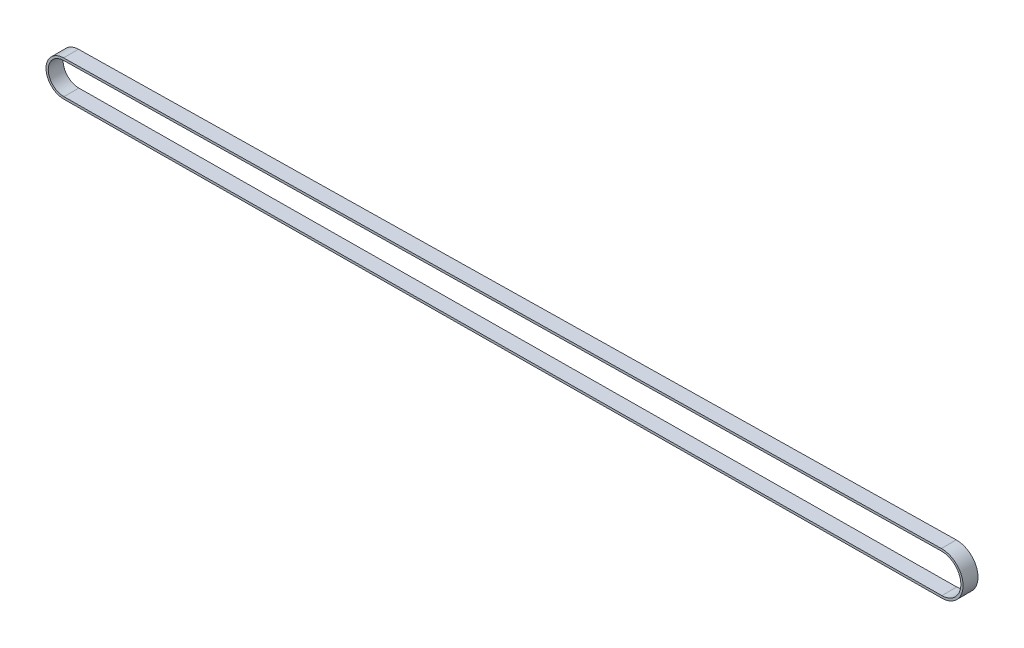
ISO-10303-21;
HEADER;
FILE_DESCRIPTION(('STEP AP214'),'2;1');
FILE_NAME('part.step','',(''),(''),'','','');
FILE_SCHEMA(('AUTOMOTIVE_DESIGN { 1 0 10303 214 1 1 1 1 }'));
ENDSEC;
DATA;
#1=APPLICATION_CONTEXT('core data for automotive mechanical design processes');
#2=APPLICATION_PROTOCOL_DEFINITION('international standard','automotive_design',2000,#1);
#3=PRODUCT_CONTEXT('',#1,'mechanical');
#4=PRODUCT('Part','Part','',(#3));
#5=PRODUCT_RELATED_PRODUCT_CATEGORY('part','',(#4));
#6=PRODUCT_DEFINITION_FORMATION('','',#4);
#7=PRODUCT_DEFINITION_CONTEXT('part definition',#1,'design');
#8=PRODUCT_DEFINITION('design','',#6,#7);
#9=PRODUCT_DEFINITION_SHAPE('','',#8);
#10=(LENGTH_UNIT() NAMED_UNIT(*) SI_UNIT(.MILLI.,.METRE.));
#11=(NAMED_UNIT(*) PLANE_ANGLE_UNIT() SI_UNIT($,.RADIAN.));
#12=(NAMED_UNIT(*) SI_UNIT($,.STERADIAN.) SOLID_ANGLE_UNIT());
#13=UNCERTAINTY_MEASURE_WITH_UNIT(LENGTH_MEASURE(1.E-05),#10,'distance_accuracy_value','');
#14=(GEOMETRIC_REPRESENTATION_CONTEXT(3) GLOBAL_UNCERTAINTY_ASSIGNED_CONTEXT((#13)) GLOBAL_UNIT_ASSIGNED_CONTEXT((#10,
#11,#12)) REPRESENTATION_CONTEXT('',''));
#15=CARTESIAN_POINT('',(0.,0.,0.));
#16=DIRECTION('',(0.,0.,1.));
#17=DIRECTION('',(1.,0.,0.));
#18=AXIS2_PLACEMENT_3D('',#15,#16,#17);
#19=CARTESIAN_POINT('',(0.497907466428943,-4.82437437963457,2.5));
#20=DIRECTION('',(0.,0.,-1.));
#21=DIRECTION('',(-1.,0.,0.));
#22=AXIS2_PLACEMENT_3D('',#19,#20,#21);
#23=CYLINDRICAL_SURFACE('',#22,5.975);
#24=CARTESIAN_POINT('',(0.497907466428943,-4.82437437963457,-2.5));
#25=DIRECTION('',(0.,0.,-1.));
#26=DIRECTION('',(-1.,0.,0.));
#27=AXIS2_PLACEMENT_3D('',#24,#25,#26);
#28=CIRCLE('',#27,5.975);
#29=CARTESIAN_POINT('',(0.544490680319643,-10.799192787267,-2.5));
#30=VERTEX_POINT('',#29);
#31=CARTESIAN_POINT('',(0.402597054026486,1.14986539838637,-2.5));
#32=VERTEX_POINT('',#31);
#33=EDGE_CURVE('E157',#30,#32,#28,.T.);
#34=ORIENTED_EDGE('',*,*,#33,.F.);
#35=DIRECTION('',(0.,0.,-1.));
#36=VECTOR('',#35,1.);
#37=CARTESIAN_POINT('',(0.544490680319643,-10.799192787267,2.5));
#38=LINE('',#37,#36);
#39=CARTESIAN_POINT('',(0.544490680319643,-10.799192787267,2.5));
#40=VERTEX_POINT('',#39);
#41=EDGE_CURVE('E12',#40,#30,#38,.T.);
#42=ORIENTED_EDGE('',*,*,#41,.F.);
#43=CARTESIAN_POINT('',(0.497907466428943,-4.82437437963457,2.5));
#44=DIRECTION('',(0.,0.,-1.));
#45=DIRECTION('',(-1.,0.,0.));
#46=AXIS2_PLACEMENT_3D('',#43,#44,#45);
#47=CIRCLE('',#46,5.975);
#48=CARTESIAN_POINT('',(0.402597054026486,1.14986539838637,2.5));
#49=VERTEX_POINT('',#48);
#50=EDGE_CURVE('E161',#40,#49,#47,.T.);
#51=ORIENTED_EDGE('',*,*,#50,.T.);
#52=DIRECTION('',(0.,0.,-1.));
#53=VECTOR('',#52,1.);
#54=CARTESIAN_POINT('',(0.402597054026486,1.14986539838637,2.5));
#55=LINE('',#54,#53);
#56=EDGE_CURVE('E62',#49,#32,#55,.T.);
#57=ORIENTED_EDGE('',*,*,#56,.T.);
#58=EDGE_LOOP('',(#34,#42,#51,#57));
#59=FACE_BOUND('',#58,.T.);
#60=ADVANCED_FACE('F59',(#59),#23,.T.);
#61=CARTESIAN_POINT('',(0.544490680319672,-10.799192787267,2.5));
#62=DIRECTION('',(0.00779635378924341,-0.999969607971959,0.));
#63=DIRECTION('',(0.999969607971959,0.00779635378924341,0.));
#64=AXIS2_PLACEMENT_3D('',#61,#62,#63);
#65=PLANE('',#64);
#66=DIRECTION('',(-0.999969607971959,-0.00779635378924341,0.));
#67=VECTOR('',#66,1.);
#68=CARTESIAN_POINT('',(0.544490680319672,-10.799192787267,-2.5));
#69=LINE('',#68,#67);
#70=CARTESIAN_POINT('',(294.803846304865,-8.50497301903174,-2.5));
#71=VERTEX_POINT('',#70);
#72=EDGE_CURVE('E165',#71,#30,#69,.T.);
#73=ORIENTED_EDGE('',*,*,#72,.F.);
#74=DIRECTION('',(0.,0.,-1.));
#75=VECTOR('',#74,1.);
#76=CARTESIAN_POINT('',(294.803846304865,-8.50497301903174,2.5));
#77=LINE('',#76,#75);
#78=CARTESIAN_POINT('',(294.803846304865,-8.50497301903174,2.5));
#79=VERTEX_POINT('',#78);
#80=EDGE_CURVE('E67',#79,#71,#77,.T.);
#81=ORIENTED_EDGE('',*,*,#80,.F.);
#82=DIRECTION('',(-0.999969607971959,-0.00779635378924341,0.));
#83=VECTOR('',#82,1.);
#84=CARTESIAN_POINT('',(0.544490680319672,-10.799192787267,2.5));
#85=LINE('',#84,#83);
#86=EDGE_CURVE('E171',#79,#40,#85,.T.);
#87=ORIENTED_EDGE('',*,*,#86,.T.);
#88=ORIENTED_EDGE('',*,*,#41,.T.);
#89=EDGE_LOOP('',(#73,#81,#87,#88));
#90=FACE_BOUND('',#89,.T.);
#91=ADVANCED_FACE('F197',(#90),#65,.T.);
#92=CARTESIAN_POINT('',(294.747907466428,-1.33019108183294,2.5));
#93=DIRECTION('',(0.,0.,-1.));
#94=DIRECTION('',(-1.,0.,0.));
#95=AXIS2_PLACEMENT_3D('',#92,#93,#94);
#96=CYLINDRICAL_SURFACE('',#95,7.175);
#97=CARTESIAN_POINT('',(294.747907466428,-1.33019108183294,-2.5));
#98=DIRECTION('',(0.,0.,-1.));
#99=DIRECTION('',(-1.,0.,0.));
#100=AXIS2_PLACEMENT_3D('',#97,#98,#99);
#101=CIRCLE('',#100,7.175);
#102=CARTESIAN_POINT('',(294.633455213877,5.84389601562317,-2.5));
#103=VERTEX_POINT('',#102);
#104=EDGE_CURVE('E179',#103,#71,#101,.T.);
#105=ORIENTED_EDGE('',*,*,#104,.F.);
#106=DIRECTION('',(0.,0.,-1.));
#107=VECTOR('',#106,1.);
#108=CARTESIAN_POINT('',(294.633455213877,5.84389601562317,2.5));
#109=LINE('',#108,#107);
#110=CARTESIAN_POINT('',(294.633455213877,5.84389601562317,2.5));
#111=VERTEX_POINT('',#110);
#112=EDGE_CURVE('E184',#111,#103,#109,.T.);
#113=ORIENTED_EDGE('',*,*,#112,.F.);
#114=CARTESIAN_POINT('',(294.747907466428,-1.33019108183294,2.5));
#115=DIRECTION('',(0.,0.,-1.));
#116=DIRECTION('',(-1.,0.,0.));
#117=AXIS2_PLACEMENT_3D('',#114,#115,#116);
#118=CIRCLE('',#117,7.175);
#119=EDGE_CURVE('E168',#111,#79,#118,.T.);
#120=ORIENTED_EDGE('',*,*,#119,.T.);
#121=ORIENTED_EDGE('',*,*,#80,.T.);
#122=EDGE_LOOP('',(#105,#113,#120,#121));
#123=FACE_BOUND('',#122,.T.);
#124=ADVANCED_FACE('F201',(#123),#96,.T.);
#125=CARTESIAN_POINT('',(0.402597054026486,1.14986539838637,2.5));
#126=DIRECTION('',(-0.0159515334564782,0.999872766195973,0.));
#127=DIRECTION('',(-0.999872766195973,-0.0159515334564782,0.));
#128=AXIS2_PLACEMENT_3D('',#125,#126,#127);
#129=PLANE('',#128);
#130=DIRECTION('',(0.999872766195973,0.0159515334564782,0.));
#131=VECTOR('',#130,1.);
#132=CARTESIAN_POINT('',(0.402597054026486,1.14986539838637,-2.5));
#133=LINE('',#132,#131);
#134=EDGE_CURVE('E176',#32,#103,#133,.T.);
#135=ORIENTED_EDGE('',*,*,#134,.F.);
#136=ORIENTED_EDGE('',*,*,#56,.F.);
#137=DIRECTION('',(0.999872766195973,0.0159515334564782,0.));
#138=VECTOR('',#137,1.);
#139=CARTESIAN_POINT('',(0.402597054026486,1.14986539838637,2.5));
#140=LINE('',#139,#138);
#141=EDGE_CURVE('E164',#49,#111,#140,.T.);
#142=ORIENTED_EDGE('',*,*,#141,.T.);
#143=ORIENTED_EDGE('',*,*,#112,.T.);
#144=EDGE_LOOP('',(#135,#136,#142,#143));
#145=FACE_BOUND('',#144,.T.);
#146=ADVANCED_FACE('F192',(#145),#129,.T.);
#147=CARTESIAN_POINT('',(0.497907466428943,-4.82437437963457,2.5));
#148=DIRECTION('',(0.,0.,-1.));
#149=DIRECTION('',(-1.,0.,0.));
#150=AXIS2_PLACEMENT_3D('',#147,#148,#149);
#151=PLANE('',#150);
#152=DIRECTION('',(-0.999969607971959,-0.00779635378924341,0.));
#153=VECTOR('',#152,1.);
#154=CARTESIAN_POINT('',(294.797999039523,-7.75499581305277,2.5));
#155=LINE('',#154,#153);
#156=CARTESIAN_POINT('',(294.797999039523,-7.75499581305277,2.5));
#157=VERTEX_POINT('',#156);
#158=CARTESIAN_POINT('',(0.53864341497774,-10.0492155812881,2.5));
#159=VERTEX_POINT('',#158);
#160=EDGE_CURVE('E132',#157,#159,#155,.T.);
#161=ORIENTED_EDGE('',*,*,#160,.T.);
#162=CARTESIAN_POINT('',(0.497907466428943,-4.82437437963457,2.5));
#163=DIRECTION('',(0.,0.,-1.));
#164=DIRECTION('',(-1.,0.,0.));
#165=AXIS2_PLACEMENT_3D('',#162,#163,#164);
#166=CIRCLE('',#165,5.225);
#167=CARTESIAN_POINT('',(0.414560704118844,0.399960823739393,2.5));
#168=VERTEX_POINT('',#167);
#169=EDGE_CURVE('E126',#159,#168,#166,.T.);
#170=ORIENTED_EDGE('',*,*,#169,.T.);
#171=DIRECTION('',(0.999872766195973,0.0159515334564782,0.));
#172=VECTOR('',#171,1.);
#173=CARTESIAN_POINT('',(0.414560704118844,0.399960823739393,2.5));
#174=LINE('',#173,#172);
#175=CARTESIAN_POINT('',(294.64541886397,5.09399144097619,2.5));
#176=VERTEX_POINT('',#175);
#177=EDGE_CURVE('E135',#168,#176,#174,.T.);
#178=ORIENTED_EDGE('',*,*,#177,.T.);
#179=CARTESIAN_POINT('',(294.747907466428,-1.33019108183294,2.5));
#180=DIRECTION('',(0.,0.,-1.));
#181=DIRECTION('',(-1.,0.,0.));
#182=AXIS2_PLACEMENT_3D('',#179,#180,#181);
#183=CIRCLE('',#182,6.425);
#184=EDGE_CURVE('E75',#176,#157,#183,.T.);
#185=ORIENTED_EDGE('',*,*,#184,.T.);
#186=EDGE_LOOP('',(#161,#170,#178,#185));
#187=FACE_BOUND('',#186,.T.);
#188=ORIENTED_EDGE('',*,*,#50,.F.);
#189=ORIENTED_EDGE('',*,*,#86,.F.);
#190=ORIENTED_EDGE('',*,*,#119,.F.);
#191=ORIENTED_EDGE('',*,*,#141,.F.);
#192=EDGE_LOOP('',(#188,#189,#190,#191));
#193=FACE_BOUND('',#192,.T.);
#194=ADVANCED_FACE('F139',(#187,#193),#151,.F.);
#195=CARTESIAN_POINT('',(0.497907466428943,-4.82437437963457,-2.5));
#196=DIRECTION('',(0.,0.,-1.));
#197=DIRECTION('',(-1.,0.,0.));
#198=AXIS2_PLACEMENT_3D('',#195,#196,#197);
#199=PLANE('',#198);
#200=CARTESIAN_POINT('',(0.497907466428943,-4.82437437963457,-2.5));
#201=DIRECTION('',(0.,0.,-1.));
#202=DIRECTION('',(-1.,0.,0.));
#203=AXIS2_PLACEMENT_3D('',#200,#201,#202);
#204=CIRCLE('',#203,5.225);
#205=CARTESIAN_POINT('',(0.53864341497774,-10.0492155812881,-2.5));
#206=VERTEX_POINT('',#205);
#207=CARTESIAN_POINT('',(0.414560704118844,0.399960823739393,-2.5));
#208=VERTEX_POINT('',#207);
#209=EDGE_CURVE('E83',#206,#208,#204,.T.);
#210=ORIENTED_EDGE('',*,*,#209,.F.);
#211=DIRECTION('',(-0.999969607971959,-0.00779635378924341,0.));
#212=VECTOR('',#211,1.);
#213=CARTESIAN_POINT('',(294.797999039523,-7.75499581305277,-2.5));
#214=LINE('',#213,#212);
#215=CARTESIAN_POINT('',(294.797999039523,-7.75499581305277,-2.5));
#216=VERTEX_POINT('',#215);
#217=EDGE_CURVE('E142',#216,#206,#214,.T.);
#218=ORIENTED_EDGE('',*,*,#217,.F.);
#219=CARTESIAN_POINT('',(294.747907466428,-1.33019108183294,-2.5));
#220=DIRECTION('',(0.,0.,-1.));
#221=DIRECTION('',(-1.,0.,0.));
#222=AXIS2_PLACEMENT_3D('',#219,#220,#221);
#223=CIRCLE('',#222,6.425);
#224=CARTESIAN_POINT('',(294.64541886397,5.09399144097619,-2.5));
#225=VERTEX_POINT('',#224);
#226=EDGE_CURVE('E145',#225,#216,#223,.T.);
#227=ORIENTED_EDGE('',*,*,#226,.F.);
#228=DIRECTION('',(0.999872766195973,0.0159515334564782,0.));
#229=VECTOR('',#228,1.);
#230=CARTESIAN_POINT('',(0.414560704118844,0.399960823739393,-2.5));
#231=LINE('',#230,#229);
#232=EDGE_CURVE('E151',#208,#225,#231,.T.);
#233=ORIENTED_EDGE('',*,*,#232,.F.);
#234=EDGE_LOOP('',(#210,#218,#227,#233));
#235=FACE_BOUND('',#234,.T.);
#236=ORIENTED_EDGE('',*,*,#33,.T.);
#237=ORIENTED_EDGE('',*,*,#134,.T.);
#238=ORIENTED_EDGE('',*,*,#104,.T.);
#239=ORIENTED_EDGE('',*,*,#72,.T.);
#240=EDGE_LOOP('',(#236,#237,#238,#239));
#241=FACE_BOUND('',#240,.T.);
#242=ADVANCED_FACE('F194',(#235,#241),#199,.T.);
#243=CARTESIAN_POINT('',(0.497907466428943,-4.82437437963457,2.5));
#244=DIRECTION('',(0.,0.,-1.));
#245=DIRECTION('',(-1.,0.,0.));
#246=AXIS2_PLACEMENT_3D('',#243,#244,#245);
#247=CYLINDRICAL_SURFACE('',#246,5.225);
#248=ORIENTED_EDGE('',*,*,#209,.T.);
#249=DIRECTION('',(0.,0.,-1.));
#250=VECTOR('',#249,1.);
#251=CARTESIAN_POINT('',(0.414560704118844,0.399960823739393,2.5));
#252=LINE('',#251,#250);
#253=EDGE_CURVE('E122',#168,#208,#252,.T.);
#254=ORIENTED_EDGE('',*,*,#253,.F.);
#255=ORIENTED_EDGE('',*,*,#169,.F.);
#256=DIRECTION('',(0.,0.,-1.));
#257=VECTOR('',#256,1.);
#258=CARTESIAN_POINT('',(0.53864341497774,-10.0492155812881,2.5));
#259=LINE('',#258,#257);
#260=EDGE_CURVE('E155',#159,#206,#259,.T.);
#261=ORIENTED_EDGE('',*,*,#260,.T.);
#262=EDGE_LOOP('',(#248,#254,#255,#261));
#263=FACE_BOUND('',#262,.T.);
#264=ADVANCED_FACE('F124',(#263),#247,.F.);
#265=CARTESIAN_POINT('',(294.797999039523,-7.75499581305277,2.5));
#266=DIRECTION('',(0.00779635378924341,-0.999969607971959,0.));
#267=DIRECTION('',(0.999969607971959,0.00779635378924341,0.));
#268=AXIS2_PLACEMENT_3D('',#265,#266,#267);
#269=PLANE('',#268);
#270=ORIENTED_EDGE('',*,*,#217,.T.);
#271=ORIENTED_EDGE('',*,*,#260,.F.);
#272=ORIENTED_EDGE('',*,*,#160,.F.);
#273=DIRECTION('',(0.,0.,-1.));
#274=VECTOR('',#273,1.);
#275=CARTESIAN_POINT('',(294.797999039523,-7.75499581305277,2.5));
#276=LINE('',#275,#274);
#277=EDGE_CURVE('E158',#157,#216,#276,.T.);
#278=ORIENTED_EDGE('',*,*,#277,.T.);
#279=EDGE_LOOP('',(#270,#271,#272,#278));
#280=FACE_BOUND('',#279,.T.);
#281=ADVANCED_FACE('F252',(#280),#269,.F.);
#282=CARTESIAN_POINT('',(294.747907466428,-1.33019108183294,2.5));
#283=DIRECTION('',(0.,0.,-1.));
#284=DIRECTION('',(-1.,0.,0.));
#285=AXIS2_PLACEMENT_3D('',#282,#283,#284);
#286=CYLINDRICAL_SURFACE('',#285,6.425);
#287=ORIENTED_EDGE('',*,*,#226,.T.);
#288=ORIENTED_EDGE('',*,*,#277,.F.);
#289=ORIENTED_EDGE('',*,*,#184,.F.);
#290=DIRECTION('',(0.,0.,-1.));
#291=VECTOR('',#290,1.);
#292=CARTESIAN_POINT('',(294.64541886397,5.09399144097619,2.5));
#293=LINE('',#292,#291);
#294=EDGE_CURVE('E131',#176,#225,#293,.T.);
#295=ORIENTED_EDGE('',*,*,#294,.T.);
#296=EDGE_LOOP('',(#287,#288,#289,#295));
#297=FACE_BOUND('',#296,.T.);
#298=ADVANCED_FACE('F261',(#297),#286,.F.);
#299=CARTESIAN_POINT('',(0.414560704118844,0.399960823739393,2.5));
#300=DIRECTION('',(-0.0159515334564782,0.999872766195973,0.));
#301=DIRECTION('',(-0.999872766195973,-0.0159515334564782,0.));
#302=AXIS2_PLACEMENT_3D('',#299,#300,#301);
#303=PLANE('',#302);
#304=ORIENTED_EDGE('',*,*,#232,.T.);
#305=ORIENTED_EDGE('',*,*,#294,.F.);
#306=ORIENTED_EDGE('',*,*,#177,.F.);
#307=ORIENTED_EDGE('',*,*,#253,.T.);
#308=EDGE_LOOP('',(#304,#305,#306,#307));
#309=FACE_BOUND('',#308,.T.);
#310=ADVANCED_FACE('F136',(#309),#303,.F.);
#311=CLOSED_SHELL('',(#60,#91,#124,#146,#194,#242,#264,#281,#298,#310));
#312=MANIFOLD_SOLID_BREP('B2',#311);
#313=ADVANCED_BREP_SHAPE_REPRESENTATION('',(#18,#312),#14);
#314=SHAPE_DEFINITION_REPRESENTATION(#9,#313);
ENDSEC;
END-ISO-10303-21;
